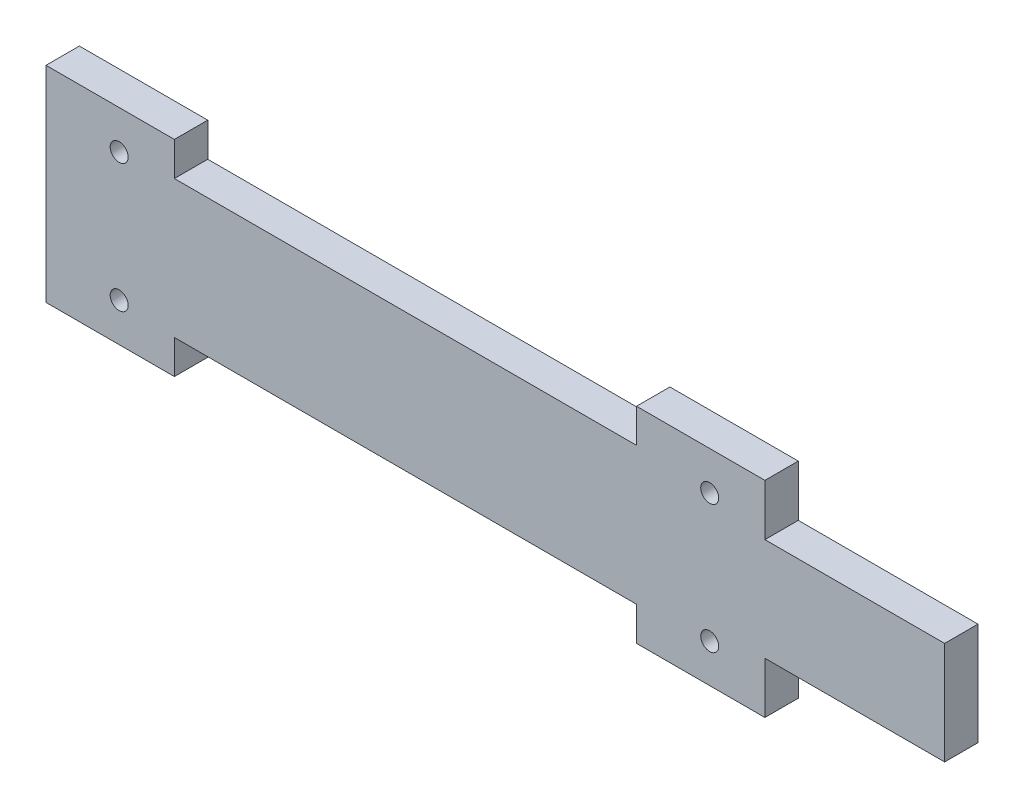
ISO-10303-21;
HEADER;
FILE_DESCRIPTION(('STEP AP214'),'2;1');
FILE_NAME('part.step','',(''),(''),'','','');
FILE_SCHEMA(('AUTOMOTIVE_DESIGN { 1 0 10303 214 1 1 1 1 }'));
ENDSEC;
DATA;
#1=APPLICATION_CONTEXT('core data for automotive mechanical design processes');
#2=APPLICATION_PROTOCOL_DEFINITION('international standard','automotive_design',2000,#1);
#3=PRODUCT_CONTEXT('',#1,'mechanical');
#4=PRODUCT('Part','Part','',(#3));
#5=PRODUCT_RELATED_PRODUCT_CATEGORY('part','',(#4));
#6=PRODUCT_DEFINITION_FORMATION('','',#4);
#7=PRODUCT_DEFINITION_CONTEXT('part definition',#1,'design');
#8=PRODUCT_DEFINITION('design','',#6,#7);
#9=PRODUCT_DEFINITION_SHAPE('','',#8);
#10=(LENGTH_UNIT() NAMED_UNIT(*) SI_UNIT(.MILLI.,.METRE.));
#11=(NAMED_UNIT(*) PLANE_ANGLE_UNIT() SI_UNIT($,.RADIAN.));
#12=(NAMED_UNIT(*) SI_UNIT($,.STERADIAN.) SOLID_ANGLE_UNIT());
#13=UNCERTAINTY_MEASURE_WITH_UNIT(LENGTH_MEASURE(1.E-05),#10,'distance_accuracy_value','');
#14=(GEOMETRIC_REPRESENTATION_CONTEXT(3) GLOBAL_UNCERTAINTY_ASSIGNED_CONTEXT((#13)) GLOBAL_UNIT_ASSIGNED_CONTEXT((#10,
#11,#12)) REPRESENTATION_CONTEXT('',''));
#15=CARTESIAN_POINT('',(0.,0.,0.));
#16=DIRECTION('',(0.,0.,1.));
#17=DIRECTION('',(1.,0.,0.));
#18=AXIS2_PLACEMENT_3D('',#15,#16,#17);
#19=CARTESIAN_POINT('',(0.,0.,13.));
#20=DIRECTION('',(0.,0.,-1.));
#21=DIRECTION('',(-1.,0.,0.));
#22=AXIS2_PLACEMENT_3D('',#19,#20,#21);
#23=PLANE('',#22);
#24=DIRECTION('',(-1.,0.,0.));
#25=VECTOR('',#24,1.);
#26=CARTESIAN_POINT('',(-103.143983002157,40.,13.));
#27=LINE('',#26,#25);
#28=CARTESIAN_POINT('',(-53.1439830021565,40.,13.));
#29=VERTEX_POINT('',#28);
#30=CARTESIAN_POINT('',(-103.143983002157,40.,13.));
#31=VERTEX_POINT('',#30);
#32=EDGE_CURVE('E209',#29,#31,#27,.T.);
#33=ORIENTED_EDGE('',*,*,#32,.T.);
#34=DIRECTION('',(0.,-1.,0.));
#35=VECTOR('',#34,1.);
#36=CARTESIAN_POINT('',(-103.143983002157,-40.,13.));
#37=LINE('',#36,#35);
#38=CARTESIAN_POINT('',(-103.143983002157,-40.,13.));
#39=VERTEX_POINT('',#38);
#40=EDGE_CURVE('E117',#31,#39,#37,.T.);
#41=ORIENTED_EDGE('',*,*,#40,.T.);
#42=DIRECTION('',(1.,0.,0.));
#43=VECTOR('',#42,1.);
#44=CARTESIAN_POINT('',(-103.143983002157,-40.,13.));
#45=LINE('',#44,#43);
#46=CARTESIAN_POINT('',(-53.1439830021565,-40.,13.));
#47=VERTEX_POINT('',#46);
#48=EDGE_CURVE('E248',#39,#47,#45,.T.);
#49=ORIENTED_EDGE('',*,*,#48,.T.);
#50=DIRECTION('',(0.,1.,0.));
#51=VECTOR('',#50,1.);
#52=CARTESIAN_POINT('',(-53.1439830021565,-40.,13.));
#53=LINE('',#52,#51);
#54=CARTESIAN_POINT('',(-53.1439830021565,-26.8041237113402,13.));
#55=VERTEX_POINT('',#54);
#56=EDGE_CURVE('E267',#47,#55,#53,.T.);
#57=ORIENTED_EDGE('',*,*,#56,.T.);
#58=DIRECTION('',(1.,0.,0.));
#59=VECTOR('',#58,1.);
#60=CARTESIAN_POINT('',(-53.1439830021565,-26.8041237113402,13.));
#61=LINE('',#60,#59);
#62=CARTESIAN_POINT('',(126.856016997843,-26.8041237113402,13.));
#63=VERTEX_POINT('',#62);
#64=EDGE_CURVE('E264',#55,#63,#61,.T.);
#65=ORIENTED_EDGE('',*,*,#64,.T.);
#66=DIRECTION('',(0.,-1.,0.));
#67=VECTOR('',#66,1.);
#68=CARTESIAN_POINT('',(126.856016997843,-26.8041237113402,13.));
#69=LINE('',#68,#67);
#70=CARTESIAN_POINT('',(126.856016997843,-40.,13.));
#71=VERTEX_POINT('',#70);
#72=EDGE_CURVE('E266',#63,#71,#69,.T.);
#73=ORIENTED_EDGE('',*,*,#72,.T.);
#74=DIRECTION('',(1.,0.,0.));
#75=VECTOR('',#74,1.);
#76=CARTESIAN_POINT('',(126.856016997843,-40.,13.));
#77=LINE('',#76,#75);
#78=CARTESIAN_POINT('',(176.856016997843,-40.,13.));
#79=VERTEX_POINT('',#78);
#80=EDGE_CURVE('E269',#71,#79,#77,.T.);
#81=ORIENTED_EDGE('',*,*,#80,.T.);
#82=DIRECTION('',(0.,1.,0.));
#83=VECTOR('',#82,1.);
#84=CARTESIAN_POINT('',(176.856016997843,-40.,13.));
#85=LINE('',#84,#83);
#86=CARTESIAN_POINT('',(176.856016997843,-20.,13.));
#87=VERTEX_POINT('',#86);
#88=EDGE_CURVE('E275',#79,#87,#85,.T.);
#89=ORIENTED_EDGE('',*,*,#88,.T.);
#90=DIRECTION('',(1.,0.,0.));
#91=VECTOR('',#90,1.);
#92=CARTESIAN_POINT('',(176.856016997843,-20.,13.));
#93=LINE('',#92,#91);
#94=CARTESIAN_POINT('',(246.856016997843,-20.,13.));
#95=VERTEX_POINT('',#94);
#96=EDGE_CURVE('E277',#87,#95,#93,.T.);
#97=ORIENTED_EDGE('',*,*,#96,.T.);
#98=DIRECTION('',(0.,1.,0.));
#99=VECTOR('',#98,1.);
#100=CARTESIAN_POINT('',(246.856016997843,20.,13.));
#101=LINE('',#100,#99);
#102=CARTESIAN_POINT('',(246.856016997843,20.,13.));
#103=VERTEX_POINT('',#102);
#104=EDGE_CURVE('E279',#95,#103,#101,.T.);
#105=ORIENTED_EDGE('',*,*,#104,.T.);
#106=DIRECTION('',(-1.,0.,0.));
#107=VECTOR('',#106,1.);
#108=CARTESIAN_POINT('',(176.856016997843,20.,13.));
#109=LINE('',#108,#107);
#110=CARTESIAN_POINT('',(176.856016997843,20.,13.));
#111=VERTEX_POINT('',#110);
#112=EDGE_CURVE('E281',#103,#111,#109,.T.);
#113=ORIENTED_EDGE('',*,*,#112,.T.);
#114=DIRECTION('',(0.,1.,0.));
#115=VECTOR('',#114,1.);
#116=CARTESIAN_POINT('',(176.856016997843,40.,13.));
#117=LINE('',#116,#115);
#118=CARTESIAN_POINT('',(176.856016997843,40.,13.));
#119=VERTEX_POINT('',#118);
#120=EDGE_CURVE('E283',#111,#119,#117,.T.);
#121=ORIENTED_EDGE('',*,*,#120,.T.);
#122=DIRECTION('',(-1.,0.,0.));
#123=VECTOR('',#122,1.);
#124=CARTESIAN_POINT('',(126.856016997843,40.,13.));
#125=LINE('',#124,#123);
#126=CARTESIAN_POINT('',(126.856016997843,40.,13.));
#127=VERTEX_POINT('',#126);
#128=EDGE_CURVE('E160',#119,#127,#125,.T.);
#129=ORIENTED_EDGE('',*,*,#128,.T.);
#130=DIRECTION('',(0.,-1.,0.));
#131=VECTOR('',#130,1.);
#132=CARTESIAN_POINT('',(126.856016997843,26.8041237113402,13.));
#133=LINE('',#132,#131);
#134=CARTESIAN_POINT('',(126.856016997843,26.8041237113402,13.));
#135=VERTEX_POINT('',#134);
#136=EDGE_CURVE('E154',#127,#135,#133,.T.);
#137=ORIENTED_EDGE('',*,*,#136,.T.);
#138=DIRECTION('',(-1.,0.,0.));
#139=VECTOR('',#138,1.);
#140=CARTESIAN_POINT('',(-53.1439830021566,26.8041237113402,13.));
#141=LINE('',#140,#139);
#142=CARTESIAN_POINT('',(-53.1439830021566,26.8041237113402,13.));
#143=VERTEX_POINT('',#142);
#144=EDGE_CURVE('E158',#135,#143,#141,.T.);
#145=ORIENTED_EDGE('',*,*,#144,.T.);
#146=DIRECTION('',(0.,1.,0.));
#147=VECTOR('',#146,1.);
#148=CARTESIAN_POINT('',(-53.1439830021565,40.,13.));
#149=LINE('',#148,#147);
#150=EDGE_CURVE('E50',#143,#29,#149,.T.);
#151=ORIENTED_EDGE('',*,*,#150,.T.);
#152=EDGE_LOOP('',(#33,#41,#49,#57,#65,#73,#81,#89,#97,#105,#113,#121,#129,#137,#145,#151));
#153=FACE_BOUND('',#152,.T.);
#154=CARTESIAN_POINT('',(-74.6439830021565,25.,13.));
#155=DIRECTION('',(0.,0.,1.));
#156=DIRECTION('',(1.,0.,0.));
#157=AXIS2_PLACEMENT_3D('',#154,#155,#156);
#158=CIRCLE('',#157,3.50000000000001);
#159=CARTESIAN_POINT('',(-78.1439830021566,25.,13.));
#160=VERTEX_POINT('',#159);
#161=EDGE_CURVE('E182',#160,#160,#158,.T.);
#162=ORIENTED_EDGE('',*,*,#161,.F.);
#163=EDGE_LOOP('',(#162));
#164=FACE_BOUND('',#163,.T.);
#165=CARTESIAN_POINT('',(155.356016997843,25.,13.));
#166=DIRECTION('',(0.,0.,1.));
#167=DIRECTION('',(1.,0.,0.));
#168=AXIS2_PLACEMENT_3D('',#165,#166,#167);
#169=CIRCLE('',#168,3.49999999999999);
#170=CARTESIAN_POINT('',(151.856016997843,25.,13.));
#171=VERTEX_POINT('',#170);
#172=EDGE_CURVE('E347',#171,#171,#169,.T.);
#173=ORIENTED_EDGE('',*,*,#172,.F.);
#174=EDGE_LOOP('',(#173));
#175=FACE_BOUND('',#174,.T.);
#176=CARTESIAN_POINT('',(155.356016997843,-25.,13.));
#177=DIRECTION('',(0.,0.,1.));
#178=DIRECTION('',(1.,0.,0.));
#179=AXIS2_PLACEMENT_3D('',#176,#177,#178);
#180=CIRCLE('',#179,3.49999999999999);
#181=CARTESIAN_POINT('',(151.856016997843,-25.,13.));
#182=VERTEX_POINT('',#181);
#183=EDGE_CURVE('E341',#182,#182,#180,.T.);
#184=ORIENTED_EDGE('',*,*,#183,.F.);
#185=EDGE_LOOP('',(#184));
#186=FACE_BOUND('',#185,.T.);
#187=CARTESIAN_POINT('',(-74.6439830021565,-25.,13.));
#188=DIRECTION('',(0.,0.,1.));
#189=DIRECTION('',(1.,0.,0.));
#190=AXIS2_PLACEMENT_3D('',#187,#188,#189);
#191=CIRCLE('',#190,3.50000000000001);
#192=CARTESIAN_POINT('',(-78.1439830021566,-25.,13.));
#193=VERTEX_POINT('',#192);
#194=EDGE_CURVE('E332',#193,#193,#191,.T.);
#195=ORIENTED_EDGE('',*,*,#194,.F.);
#196=EDGE_LOOP('',(#195));
#197=FACE_BOUND('',#196,.T.);
#198=ADVANCED_FACE('F33',(#153,#164,#175,#186,#197),#23,.F.);
#199=CARTESIAN_POINT('',(0.,0.,0.));
#200=DIRECTION('',(0.,0.,-1.));
#201=DIRECTION('',(-1.,0.,0.));
#202=AXIS2_PLACEMENT_3D('',#199,#200,#201);
#203=PLANE('',#202);
#204=CARTESIAN_POINT('',(155.356016997843,-25.,0.));
#205=DIRECTION('',(0.,0.,1.));
#206=DIRECTION('',(1.,0.,0.));
#207=AXIS2_PLACEMENT_3D('',#204,#205,#206);
#208=CIRCLE('',#207,3.49999999999999);
#209=CARTESIAN_POINT('',(151.856016997843,-25.,0.));
#210=VERTEX_POINT('',#209);
#211=EDGE_CURVE('E338',#210,#210,#208,.T.);
#212=ORIENTED_EDGE('',*,*,#211,.T.);
#213=EDGE_LOOP('',(#212));
#214=FACE_BOUND('',#213,.T.);
#215=CARTESIAN_POINT('',(-74.6439830021565,25.,0.));
#216=DIRECTION('',(0.,0.,1.));
#217=DIRECTION('',(1.,0.,0.));
#218=AXIS2_PLACEMENT_3D('',#215,#216,#217);
#219=CIRCLE('',#218,3.50000000000001);
#220=CARTESIAN_POINT('',(-78.1439830021566,25.,0.));
#221=VERTEX_POINT('',#220);
#222=EDGE_CURVE('E350',#221,#221,#219,.T.);
#223=ORIENTED_EDGE('',*,*,#222,.T.);
#224=EDGE_LOOP('',(#223));
#225=FACE_BOUND('',#224,.T.);
#226=DIRECTION('',(-1.,0.,0.));
#227=VECTOR('',#226,1.);
#228=CARTESIAN_POINT('',(-103.143983002157,40.,0.));
#229=LINE('',#228,#227);
#230=CARTESIAN_POINT('',(-53.1439830021565,40.,0.));
#231=VERTEX_POINT('',#230);
#232=CARTESIAN_POINT('',(-103.143983002157,40.,0.));
#233=VERTEX_POINT('',#232);
#234=EDGE_CURVE('E178',#231,#233,#229,.T.);
#235=ORIENTED_EDGE('',*,*,#234,.F.);
#236=DIRECTION('',(0.,1.,0.));
#237=VECTOR('',#236,1.);
#238=CARTESIAN_POINT('',(-53.1439830021565,40.,0.));
#239=LINE('',#238,#237);
#240=CARTESIAN_POINT('',(-53.1439830021566,26.8041237113402,0.));
#241=VERTEX_POINT('',#240);
#242=EDGE_CURVE('E109',#241,#231,#239,.T.);
#243=ORIENTED_EDGE('',*,*,#242,.F.);
#244=DIRECTION('',(-1.,0.,0.));
#245=VECTOR('',#244,1.);
#246=CARTESIAN_POINT('',(-53.1439830021566,26.8041237113402,0.));
#247=LINE('',#246,#245);
#248=CARTESIAN_POINT('',(126.856016997843,26.8041237113402,0.));
#249=VERTEX_POINT('',#248);
#250=EDGE_CURVE('E103',#249,#241,#247,.T.);
#251=ORIENTED_EDGE('',*,*,#250,.F.);
#252=DIRECTION('',(0.,-1.,0.));
#253=VECTOR('',#252,1.);
#254=CARTESIAN_POINT('',(126.856016997843,26.8041237113402,0.));
#255=LINE('',#254,#253);
#256=CARTESIAN_POINT('',(126.856016997843,40.,0.));
#257=VERTEX_POINT('',#256);
#258=EDGE_CURVE('E168',#257,#249,#255,.T.);
#259=ORIENTED_EDGE('',*,*,#258,.F.);
#260=DIRECTION('',(-1.,0.,0.));
#261=VECTOR('',#260,1.);
#262=CARTESIAN_POINT('',(126.856016997843,40.,0.));
#263=LINE('',#262,#261);
#264=CARTESIAN_POINT('',(176.856016997843,40.,0.));
#265=VERTEX_POINT('',#264);
#266=EDGE_CURVE('E204',#265,#257,#263,.T.);
#267=ORIENTED_EDGE('',*,*,#266,.F.);
#268=DIRECTION('',(0.,1.,0.));
#269=VECTOR('',#268,1.);
#270=CARTESIAN_POINT('',(176.856016997843,40.,0.));
#271=LINE('',#270,#269);
#272=CARTESIAN_POINT('',(176.856016997843,20.,0.));
#273=VERTEX_POINT('',#272);
#274=EDGE_CURVE('E202',#273,#265,#271,.T.);
#275=ORIENTED_EDGE('',*,*,#274,.F.);
#276=DIRECTION('',(-1.,0.,0.));
#277=VECTOR('',#276,1.);
#278=CARTESIAN_POINT('',(176.856016997843,20.,0.));
#279=LINE('',#278,#277);
#280=CARTESIAN_POINT('',(246.856016997843,20.,0.));
#281=VERTEX_POINT('',#280);
#282=EDGE_CURVE('E200',#281,#273,#279,.T.);
#283=ORIENTED_EDGE('',*,*,#282,.F.);
#284=DIRECTION('',(0.,1.,0.));
#285=VECTOR('',#284,1.);
#286=CARTESIAN_POINT('',(246.856016997843,20.,0.));
#287=LINE('',#286,#285);
#288=CARTESIAN_POINT('',(246.856016997843,-20.,0.));
#289=VERTEX_POINT('',#288);
#290=EDGE_CURVE('E198',#289,#281,#287,.T.);
#291=ORIENTED_EDGE('',*,*,#290,.F.);
#292=DIRECTION('',(1.,0.,0.));
#293=VECTOR('',#292,1.);
#294=CARTESIAN_POINT('',(176.856016997843,-20.,0.));
#295=LINE('',#294,#293);
#296=CARTESIAN_POINT('',(176.856016997843,-20.,0.));
#297=VERTEX_POINT('',#296);
#298=EDGE_CURVE('E196',#297,#289,#295,.T.);
#299=ORIENTED_EDGE('',*,*,#298,.F.);
#300=DIRECTION('',(0.,1.,0.));
#301=VECTOR('',#300,1.);
#302=CARTESIAN_POINT('',(176.856016997843,-40.,0.));
#303=LINE('',#302,#301);
#304=CARTESIAN_POINT('',(176.856016997843,-40.,0.));
#305=VERTEX_POINT('',#304);
#306=EDGE_CURVE('E194',#305,#297,#303,.T.);
#307=ORIENTED_EDGE('',*,*,#306,.F.);
#308=DIRECTION('',(1.,0.,0.));
#309=VECTOR('',#308,1.);
#310=CARTESIAN_POINT('',(126.856016997843,-40.,0.));
#311=LINE('',#310,#309);
#312=CARTESIAN_POINT('',(126.856016997843,-40.,0.));
#313=VERTEX_POINT('',#312);
#314=EDGE_CURVE('E192',#313,#305,#311,.T.);
#315=ORIENTED_EDGE('',*,*,#314,.F.);
#316=DIRECTION('',(0.,-1.,0.));
#317=VECTOR('',#316,1.);
#318=CARTESIAN_POINT('',(126.856016997843,-26.8041237113402,0.));
#319=LINE('',#318,#317);
#320=CARTESIAN_POINT('',(126.856016997843,-26.8041237113402,0.));
#321=VERTEX_POINT('',#320);
#322=EDGE_CURVE('E190',#321,#313,#319,.T.);
#323=ORIENTED_EDGE('',*,*,#322,.F.);
#324=DIRECTION('',(1.,0.,0.));
#325=VECTOR('',#324,1.);
#326=CARTESIAN_POINT('',(-53.1439830021565,-26.8041237113402,0.));
#327=LINE('',#326,#325);
#328=CARTESIAN_POINT('',(-53.1439830021565,-26.8041237113402,0.));
#329=VERTEX_POINT('',#328);
#330=EDGE_CURVE('E188',#329,#321,#327,.T.);
#331=ORIENTED_EDGE('',*,*,#330,.F.);
#332=DIRECTION('',(0.,1.,0.));
#333=VECTOR('',#332,1.);
#334=CARTESIAN_POINT('',(-53.1439830021565,-40.,0.));
#335=LINE('',#334,#333);
#336=CARTESIAN_POINT('',(-53.1439830021565,-40.,0.));
#337=VERTEX_POINT('',#336);
#338=EDGE_CURVE('E186',#337,#329,#335,.T.);
#339=ORIENTED_EDGE('',*,*,#338,.F.);
#340=DIRECTION('',(1.,0.,0.));
#341=VECTOR('',#340,1.);
#342=CARTESIAN_POINT('',(-103.143983002157,-40.,0.));
#343=LINE('',#342,#341);
#344=CARTESIAN_POINT('',(-103.143983002157,-40.,0.));
#345=VERTEX_POINT('',#344);
#346=EDGE_CURVE('E184',#345,#337,#343,.T.);
#347=ORIENTED_EDGE('',*,*,#346,.F.);
#348=DIRECTION('',(0.,-1.,0.));
#349=VECTOR('',#348,1.);
#350=CARTESIAN_POINT('',(-103.143983002157,-40.,0.));
#351=LINE('',#350,#349);
#352=EDGE_CURVE('E181',#233,#345,#351,.T.);
#353=ORIENTED_EDGE('',*,*,#352,.F.);
#354=EDGE_LOOP('',(#235,#243,#251,#259,#267,#275,#283,#291,#299,#307,#315,#323,#331,#339,#347,#353));
#355=FACE_BOUND('',#354,.T.);
#356=CARTESIAN_POINT('',(155.356016997843,25.,0.));
#357=DIRECTION('',(0.,0.,1.));
#358=DIRECTION('',(1.,0.,0.));
#359=AXIS2_PLACEMENT_3D('',#356,#357,#358);
#360=CIRCLE('',#359,3.49999999999999);
#361=CARTESIAN_POINT('',(151.856016997843,25.,0.));
#362=VERTEX_POINT('',#361);
#363=EDGE_CURVE('E344',#362,#362,#360,.T.);
#364=ORIENTED_EDGE('',*,*,#363,.T.);
#365=EDGE_LOOP('',(#364));
#366=FACE_BOUND('',#365,.T.);
#367=CARTESIAN_POINT('',(-74.6439830021565,-25.,0.));
#368=DIRECTION('',(0.,0.,1.));
#369=DIRECTION('',(1.,0.,0.));
#370=AXIS2_PLACEMENT_3D('',#367,#368,#369);
#371=CIRCLE('',#370,3.50000000000001);
#372=CARTESIAN_POINT('',(-78.1439830021566,-25.,0.));
#373=VERTEX_POINT('',#372);
#374=EDGE_CURVE('E335',#373,#373,#371,.T.);
#375=ORIENTED_EDGE('',*,*,#374,.T.);
#376=EDGE_LOOP('',(#375));
#377=FACE_BOUND('',#376,.T.);
#378=ADVANCED_FACE('F252',(#214,#225,#355,#366,#377),#203,.T.);
#379=CARTESIAN_POINT('',(-103.143983002157,40.,13.));
#380=DIRECTION('',(0.,-1.,0.));
#381=DIRECTION('',(0.,0.,-1.));
#382=AXIS2_PLACEMENT_3D('',#379,#380,#381);
#383=PLANE('',#382);
#384=ORIENTED_EDGE('',*,*,#234,.T.);
#385=DIRECTION('',(0.,0.,-1.));
#386=VECTOR('',#385,1.);
#387=CARTESIAN_POINT('',(-103.143983002157,40.,13.));
#388=LINE('',#387,#386);
#389=EDGE_CURVE('E11',#31,#233,#388,.T.);
#390=ORIENTED_EDGE('',*,*,#389,.F.);
#391=ORIENTED_EDGE('',*,*,#32,.F.);
#392=DIRECTION('',(0.,0.,-1.));
#393=VECTOR('',#392,1.);
#394=CARTESIAN_POINT('',(-53.1439830021565,40.,13.));
#395=LINE('',#394,#393);
#396=EDGE_CURVE('E174',#29,#231,#395,.T.);
#397=ORIENTED_EDGE('',*,*,#396,.T.);
#398=EDGE_LOOP('',(#384,#390,#391,#397));
#399=FACE_BOUND('',#398,.T.);
#400=ADVANCED_FACE('F35',(#399),#383,.F.);
#401=CARTESIAN_POINT('',(-103.143983002157,-40.,13.));
#402=DIRECTION('',(1.,0.,0.));
#403=DIRECTION('',(0.,0.,-1.));
#404=AXIS2_PLACEMENT_3D('',#401,#402,#403);
#405=PLANE('',#404);
#406=ORIENTED_EDGE('',*,*,#352,.T.);
#407=DIRECTION('',(0.,0.,-1.));
#408=VECTOR('',#407,1.);
#409=CARTESIAN_POINT('',(-103.143983002157,-40.,13.));
#410=LINE('',#409,#408);
#411=EDGE_CURVE('E42',#39,#345,#410,.T.);
#412=ORIENTED_EDGE('',*,*,#411,.F.);
#413=ORIENTED_EDGE('',*,*,#40,.F.);
#414=ORIENTED_EDGE('',*,*,#389,.T.);
#415=EDGE_LOOP('',(#406,#412,#413,#414));
#416=FACE_BOUND('',#415,.T.);
#417=ADVANCED_FACE('F502',(#416),#405,.F.);
#418=CARTESIAN_POINT('',(-103.143983002157,-40.,13.));
#419=DIRECTION('',(0.,1.,0.));
#420=DIRECTION('',(0.,0.,1.));
#421=AXIS2_PLACEMENT_3D('',#418,#419,#420);
#422=PLANE('',#421);
#423=ORIENTED_EDGE('',*,*,#346,.T.);
#424=DIRECTION('',(0.,0.,-1.));
#425=VECTOR('',#424,1.);
#426=CARTESIAN_POINT('',(-53.1439830021565,-40.,13.));
#427=LINE('',#426,#425);
#428=EDGE_CURVE('E240',#47,#337,#427,.T.);
#429=ORIENTED_EDGE('',*,*,#428,.F.);
#430=ORIENTED_EDGE('',*,*,#48,.F.);
#431=ORIENTED_EDGE('',*,*,#411,.T.);
#432=EDGE_LOOP('',(#423,#429,#430,#431));
#433=FACE_BOUND('',#432,.T.);
#434=ADVANCED_FACE('F246',(#433),#422,.F.);
#435=CARTESIAN_POINT('',(-53.1439830021565,-40.,13.));
#436=DIRECTION('',(-1.,0.,0.));
#437=DIRECTION('',(0.,0.,1.));
#438=AXIS2_PLACEMENT_3D('',#435,#436,#437);
#439=PLANE('',#438);
#440=ORIENTED_EDGE('',*,*,#338,.T.);
#441=DIRECTION('',(0.,0.,-1.));
#442=VECTOR('',#441,1.);
#443=CARTESIAN_POINT('',(-53.1439830021565,-26.8041237113402,13.));
#444=LINE('',#443,#442);
#445=EDGE_CURVE('E237',#55,#329,#444,.T.);
#446=ORIENTED_EDGE('',*,*,#445,.F.);
#447=ORIENTED_EDGE('',*,*,#56,.F.);
#448=ORIENTED_EDGE('',*,*,#428,.T.);
#449=EDGE_LOOP('',(#440,#446,#447,#448));
#450=FACE_BOUND('',#449,.T.);
#451=ADVANCED_FACE('F258',(#450),#439,.F.);
#452=CARTESIAN_POINT('',(-53.1439830021565,-26.8041237113402,13.));
#453=DIRECTION('',(0.,1.,0.));
#454=DIRECTION('',(0.,0.,1.));
#455=AXIS2_PLACEMENT_3D('',#452,#453,#454);
#456=PLANE('',#455);
#457=ORIENTED_EDGE('',*,*,#330,.T.);
#458=DIRECTION('',(0.,0.,-1.));
#459=VECTOR('',#458,1.);
#460=CARTESIAN_POINT('',(126.856016997843,-26.8041237113402,13.));
#461=LINE('',#460,#459);
#462=EDGE_CURVE('E234',#63,#321,#461,.T.);
#463=ORIENTED_EDGE('',*,*,#462,.F.);
#464=ORIENTED_EDGE('',*,*,#64,.F.);
#465=ORIENTED_EDGE('',*,*,#445,.T.);
#466=EDGE_LOOP('',(#457,#463,#464,#465));
#467=FACE_BOUND('',#466,.T.);
#468=ADVANCED_FACE('F262',(#467),#456,.F.);
#469=CARTESIAN_POINT('',(126.856016997843,-26.8041237113402,13.));
#470=DIRECTION('',(1.,0.,0.));
#471=DIRECTION('',(0.,0.,-1.));
#472=AXIS2_PLACEMENT_3D('',#469,#470,#471);
#473=PLANE('',#472);
#474=ORIENTED_EDGE('',*,*,#322,.T.);
#475=DIRECTION('',(0.,0.,-1.));
#476=VECTOR('',#475,1.);
#477=CARTESIAN_POINT('',(126.856016997843,-40.,13.));
#478=LINE('',#477,#476);
#479=EDGE_CURVE('E231',#71,#313,#478,.T.);
#480=ORIENTED_EDGE('',*,*,#479,.F.);
#481=ORIENTED_EDGE('',*,*,#72,.F.);
#482=ORIENTED_EDGE('',*,*,#462,.T.);
#483=EDGE_LOOP('',(#474,#480,#481,#482));
#484=FACE_BOUND('',#483,.T.);
#485=ADVANCED_FACE('F467',(#484),#473,.F.);
#486=CARTESIAN_POINT('',(126.856016997843,-40.,13.));
#487=DIRECTION('',(0.,1.,0.));
#488=DIRECTION('',(0.,0.,1.));
#489=AXIS2_PLACEMENT_3D('',#486,#487,#488);
#490=PLANE('',#489);
#491=ORIENTED_EDGE('',*,*,#314,.T.);
#492=DIRECTION('',(0.,0.,-1.));
#493=VECTOR('',#492,1.);
#494=CARTESIAN_POINT('',(176.856016997843,-40.,13.));
#495=LINE('',#494,#493);
#496=EDGE_CURVE('E228',#79,#305,#495,.T.);
#497=ORIENTED_EDGE('',*,*,#496,.F.);
#498=ORIENTED_EDGE('',*,*,#80,.F.);
#499=ORIENTED_EDGE('',*,*,#479,.T.);
#500=EDGE_LOOP('',(#491,#497,#498,#499));
#501=FACE_BOUND('',#500,.T.);
#502=ADVANCED_FACE('F457',(#501),#490,.F.);
#503=CARTESIAN_POINT('',(176.856016997843,-40.,13.));
#504=DIRECTION('',(-1.,0.,0.));
#505=DIRECTION('',(0.,0.,1.));
#506=AXIS2_PLACEMENT_3D('',#503,#504,#505);
#507=PLANE('',#506);
#508=ORIENTED_EDGE('',*,*,#306,.T.);
#509=DIRECTION('',(0.,0.,-1.));
#510=VECTOR('',#509,1.);
#511=CARTESIAN_POINT('',(176.856016997843,-20.,13.));
#512=LINE('',#511,#510);
#513=EDGE_CURVE('E225',#87,#297,#512,.T.);
#514=ORIENTED_EDGE('',*,*,#513,.F.);
#515=ORIENTED_EDGE('',*,*,#88,.F.);
#516=ORIENTED_EDGE('',*,*,#496,.T.);
#517=EDGE_LOOP('',(#508,#514,#515,#516));
#518=FACE_BOUND('',#517,.T.);
#519=ADVANCED_FACE('F447',(#518),#507,.F.);
#520=CARTESIAN_POINT('',(176.856016997843,-20.,13.));
#521=DIRECTION('',(0.,1.,0.));
#522=DIRECTION('',(0.,0.,1.));
#523=AXIS2_PLACEMENT_3D('',#520,#521,#522);
#524=PLANE('',#523);
#525=ORIENTED_EDGE('',*,*,#298,.T.);
#526=DIRECTION('',(0.,0.,-1.));
#527=VECTOR('',#526,1.);
#528=CARTESIAN_POINT('',(246.856016997843,-20.,13.));
#529=LINE('',#528,#527);
#530=EDGE_CURVE('E222',#95,#289,#529,.T.);
#531=ORIENTED_EDGE('',*,*,#530,.F.);
#532=ORIENTED_EDGE('',*,*,#96,.F.);
#533=ORIENTED_EDGE('',*,*,#513,.T.);
#534=EDGE_LOOP('',(#525,#531,#532,#533));
#535=FACE_BOUND('',#534,.T.);
#536=ADVANCED_FACE('F437',(#535),#524,.F.);
#537=CARTESIAN_POINT('',(246.856016997843,20.,13.));
#538=DIRECTION('',(-1.,0.,0.));
#539=DIRECTION('',(0.,0.,1.));
#540=AXIS2_PLACEMENT_3D('',#537,#538,#539);
#541=PLANE('',#540);
#542=ORIENTED_EDGE('',*,*,#290,.T.);
#543=DIRECTION('',(0.,0.,-1.));
#544=VECTOR('',#543,1.);
#545=CARTESIAN_POINT('',(246.856016997843,20.,13.));
#546=LINE('',#545,#544);
#547=EDGE_CURVE('E219',#103,#281,#546,.T.);
#548=ORIENTED_EDGE('',*,*,#547,.F.);
#549=ORIENTED_EDGE('',*,*,#104,.F.);
#550=ORIENTED_EDGE('',*,*,#530,.T.);
#551=EDGE_LOOP('',(#542,#548,#549,#550));
#552=FACE_BOUND('',#551,.T.);
#553=ADVANCED_FACE('F427',(#552),#541,.F.);
#554=CARTESIAN_POINT('',(176.856016997843,20.,13.));
#555=DIRECTION('',(0.,-1.,0.));
#556=DIRECTION('',(0.,0.,-1.));
#557=AXIS2_PLACEMENT_3D('',#554,#555,#556);
#558=PLANE('',#557);
#559=ORIENTED_EDGE('',*,*,#282,.T.);
#560=DIRECTION('',(0.,0.,-1.));
#561=VECTOR('',#560,1.);
#562=CARTESIAN_POINT('',(176.856016997843,20.,13.));
#563=LINE('',#562,#561);
#564=EDGE_CURVE('E216',#111,#273,#563,.T.);
#565=ORIENTED_EDGE('',*,*,#564,.F.);
#566=ORIENTED_EDGE('',*,*,#112,.F.);
#567=ORIENTED_EDGE('',*,*,#547,.T.);
#568=EDGE_LOOP('',(#559,#565,#566,#567));
#569=FACE_BOUND('',#568,.T.);
#570=ADVANCED_FACE('F418',(#569),#558,.F.);
#571=CARTESIAN_POINT('',(176.856016997843,40.,13.));
#572=DIRECTION('',(-1.,0.,0.));
#573=DIRECTION('',(0.,0.,1.));
#574=AXIS2_PLACEMENT_3D('',#571,#572,#573);
#575=PLANE('',#574);
#576=ORIENTED_EDGE('',*,*,#274,.T.);
#577=DIRECTION('',(0.,0.,-1.));
#578=VECTOR('',#577,1.);
#579=CARTESIAN_POINT('',(176.856016997843,40.,13.));
#580=LINE('',#579,#578);
#581=EDGE_CURVE('E213',#119,#265,#580,.T.);
#582=ORIENTED_EDGE('',*,*,#581,.F.);
#583=ORIENTED_EDGE('',*,*,#120,.F.);
#584=ORIENTED_EDGE('',*,*,#564,.T.);
#585=EDGE_LOOP('',(#576,#582,#583,#584));
#586=FACE_BOUND('',#585,.T.);
#587=ADVANCED_FACE('F289',(#586),#575,.F.);
#588=CARTESIAN_POINT('',(126.856016997843,40.,13.));
#589=DIRECTION('',(0.,-1.,0.));
#590=DIRECTION('',(0.,0.,-1.));
#591=AXIS2_PLACEMENT_3D('',#588,#589,#590);
#592=PLANE('',#591);
#593=ORIENTED_EDGE('',*,*,#266,.T.);
#594=DIRECTION('',(0.,0.,-1.));
#595=VECTOR('',#594,1.);
#596=CARTESIAN_POINT('',(126.856016997843,40.,13.));
#597=LINE('',#596,#595);
#598=EDGE_CURVE('E169',#127,#257,#597,.T.);
#599=ORIENTED_EDGE('',*,*,#598,.F.);
#600=ORIENTED_EDGE('',*,*,#128,.F.);
#601=ORIENTED_EDGE('',*,*,#581,.T.);
#602=EDGE_LOOP('',(#593,#599,#600,#601));
#603=FACE_BOUND('',#602,.T.);
#604=ADVANCED_FACE('F293',(#603),#592,.F.);
#605=CARTESIAN_POINT('',(126.856016997843,26.8041237113402,13.));
#606=DIRECTION('',(1.,0.,0.));
#607=DIRECTION('',(0.,0.,-1.));
#608=AXIS2_PLACEMENT_3D('',#605,#606,#607);
#609=PLANE('',#608);
#610=ORIENTED_EDGE('',*,*,#258,.T.);
#611=DIRECTION('',(0.,0.,-1.));
#612=VECTOR('',#611,1.);
#613=CARTESIAN_POINT('',(126.856016997843,26.8041237113402,13.));
#614=LINE('',#613,#612);
#615=EDGE_CURVE('E165',#135,#249,#614,.T.);
#616=ORIENTED_EDGE('',*,*,#615,.F.);
#617=ORIENTED_EDGE('',*,*,#136,.F.);
#618=ORIENTED_EDGE('',*,*,#598,.T.);
#619=EDGE_LOOP('',(#610,#616,#617,#618));
#620=FACE_BOUND('',#619,.T.);
#621=ADVANCED_FACE('F166',(#620),#609,.F.);
#622=CARTESIAN_POINT('',(-53.1439830021566,26.8041237113402,13.));
#623=DIRECTION('',(0.,-1.,0.));
#624=DIRECTION('',(1.,0.,0.));
#625=AXIS2_PLACEMENT_3D('',#622,#623,#624);
#626=PLANE('',#625);
#627=ORIENTED_EDGE('',*,*,#250,.T.);
#628=DIRECTION('',(0.,0.,-1.));
#629=VECTOR('',#628,1.);
#630=CARTESIAN_POINT('',(-53.1439830021566,26.8041237113402,13.));
#631=LINE('',#630,#629);
#632=EDGE_CURVE('E170',#143,#241,#631,.T.);
#633=ORIENTED_EDGE('',*,*,#632,.F.);
#634=ORIENTED_EDGE('',*,*,#144,.F.);
#635=ORIENTED_EDGE('',*,*,#615,.T.);
#636=EDGE_LOOP('',(#627,#633,#634,#635));
#637=FACE_BOUND('',#636,.T.);
#638=ADVANCED_FACE('F172',(#637),#626,.F.);
#639=CARTESIAN_POINT('',(-53.1439830021565,40.,13.));
#640=DIRECTION('',(-1.,0.,0.));
#641=DIRECTION('',(0.,-1.,0.));
#642=AXIS2_PLACEMENT_3D('',#639,#640,#641);
#643=PLANE('',#642);
#644=ORIENTED_EDGE('',*,*,#242,.T.);
#645=ORIENTED_EDGE('',*,*,#396,.F.);
#646=ORIENTED_EDGE('',*,*,#150,.F.);
#647=ORIENTED_EDGE('',*,*,#632,.T.);
#648=EDGE_LOOP('',(#644,#645,#646,#647));
#649=FACE_BOUND('',#648,.T.);
#650=ADVANCED_FACE('F297',(#649),#643,.F.);
#651=CARTESIAN_POINT('',(-74.6439830021565,25.,13.));
#652=DIRECTION('',(0.,0.,-1.));
#653=DIRECTION('',(-1.,0.,0.));
#654=AXIS2_PLACEMENT_3D('',#651,#652,#653);
#655=CYLINDRICAL_SURFACE('',#654,3.50000000000001);
#656=CARTESIAN_POINT('',(-78.1439830021566,25.,13.));
#657=CARTESIAN_POINT('',(-78.1439830021566,25.,12.8645833333333));
#658=CARTESIAN_POINT('',(-78.1439830021566,25.,12.7291666666667));
#659=CARTESIAN_POINT('',(-78.1439830021566,25.,12.4583333333333));
#660=CARTESIAN_POINT('',(-78.1439830021566,25.,12.3229166666667));
#661=CARTESIAN_POINT('',(-78.1439830021566,25.,12.0520833333333));
#662=CARTESIAN_POINT('',(-78.1439830021566,25.,11.9166666666667));
#663=CARTESIAN_POINT('',(-78.1439830021566,25.,11.6458333333333));
#664=CARTESIAN_POINT('',(-78.1439830021566,25.,11.5104166666667));
#665=CARTESIAN_POINT('',(-78.1439830021566,25.,11.2395833333333));
#666=CARTESIAN_POINT('',(-78.1439830021566,25.,11.1041666666667));
#667=CARTESIAN_POINT('',(-78.1439830021566,25.,10.8333333333333));
#668=CARTESIAN_POINT('',(-78.1439830021566,25.,10.6979166666667));
#669=CARTESIAN_POINT('',(-78.1439830021566,25.,10.4270833333333));
#670=CARTESIAN_POINT('',(-78.1439830021566,25.,10.2916666666667));
#671=CARTESIAN_POINT('',(-78.1439830021566,25.,10.0208333333333));
#672=CARTESIAN_POINT('',(-78.1439830021566,25.,9.88541666666667));
#673=CARTESIAN_POINT('',(-78.1439830021566,25.,9.61458333333333));
#674=CARTESIAN_POINT('',(-78.1439830021566,25.,9.47916666666667));
#675=CARTESIAN_POINT('',(-78.1439830021566,25.,9.20833333333333));
#676=CARTESIAN_POINT('',(-78.1439830021566,25.,9.07291666666667));
#677=CARTESIAN_POINT('',(-78.1439830021566,25.,8.80208333333333));
#678=CARTESIAN_POINT('',(-78.1439830021566,25.,8.66666666666667));
#679=CARTESIAN_POINT('',(-78.1439830021566,25.,8.39583333333333));
#680=CARTESIAN_POINT('',(-78.1439830021566,25.,8.26041666666667));
#681=CARTESIAN_POINT('',(-78.1439830021566,25.,7.98958333333333));
#682=CARTESIAN_POINT('',(-78.1439830021566,25.,7.85416666666667));
#683=CARTESIAN_POINT('',(-78.1439830021566,25.,7.58333333333333));
#684=CARTESIAN_POINT('',(-78.1439830021566,25.,7.44791666666667));
#685=CARTESIAN_POINT('',(-78.1439830021566,25.,7.17708333333333));
#686=CARTESIAN_POINT('',(-78.1439830021566,25.,7.04166666666667));
#687=CARTESIAN_POINT('',(-78.1439830021566,25.,6.77083333333333));
#688=CARTESIAN_POINT('',(-78.1439830021566,25.,6.63541666666667));
#689=CARTESIAN_POINT('',(-78.1439830021566,25.,6.36458333333333));
#690=CARTESIAN_POINT('',(-78.1439830021566,25.,6.22916666666667));
#691=CARTESIAN_POINT('',(-78.1439830021566,25.,5.95833333333333));
#692=CARTESIAN_POINT('',(-78.1439830021566,25.,5.82291666666667));
#693=CARTESIAN_POINT('',(-78.1439830021566,25.,5.55208333333333));
#694=CARTESIAN_POINT('',(-78.1439830021566,25.,5.41666666666667));
#695=CARTESIAN_POINT('',(-78.1439830021566,25.,5.14583333333333));
#696=CARTESIAN_POINT('',(-78.1439830021566,25.,5.01041666666667));
#697=CARTESIAN_POINT('',(-78.1439830021566,25.,4.73958333333333));
#698=CARTESIAN_POINT('',(-78.1439830021566,25.,4.60416666666667));
#699=CARTESIAN_POINT('',(-78.1439830021566,25.,4.33333333333333));
#700=CARTESIAN_POINT('',(-78.1439830021566,25.,4.19791666666667));
#701=CARTESIAN_POINT('',(-78.1439830021566,25.,3.92708333333333));
#702=CARTESIAN_POINT('',(-78.1439830021566,25.,3.79166666666667));
#703=CARTESIAN_POINT('',(-78.1439830021566,25.,3.52083333333333));
#704=CARTESIAN_POINT('',(-78.1439830021566,25.,3.38541666666667));
#705=CARTESIAN_POINT('',(-78.1439830021566,25.,3.11458333333333));
#706=CARTESIAN_POINT('',(-78.1439830021566,25.,2.97916666666667));
#707=CARTESIAN_POINT('',(-78.1439830021566,25.,2.70833333333333));
#708=CARTESIAN_POINT('',(-78.1439830021566,25.,2.57291666666667));
#709=CARTESIAN_POINT('',(-78.1439830021566,25.,2.30208333333333));
#710=CARTESIAN_POINT('',(-78.1439830021566,25.,2.16666666666667));
#711=CARTESIAN_POINT('',(-78.1439830021566,25.,1.89583333333333));
#712=CARTESIAN_POINT('',(-78.1439830021566,25.,1.76041666666667));
#713=CARTESIAN_POINT('',(-78.1439830021566,25.,1.48958333333333));
#714=CARTESIAN_POINT('',(-78.1439830021566,25.,1.35416666666667));
#715=CARTESIAN_POINT('',(-78.1439830021566,25.,1.08333333333333));
#716=CARTESIAN_POINT('',(-78.1439830021566,25.,0.947916666666667));
#717=CARTESIAN_POINT('',(-78.1439830021566,25.,0.677083333333334));
#718=CARTESIAN_POINT('',(-78.1439830021566,25.,0.541666666666667));
#719=CARTESIAN_POINT('',(-78.1439830021566,25.,0.270833333333334));
#720=CARTESIAN_POINT('',(-78.1439830021566,25.,0.135416666666667));
#721=CARTESIAN_POINT('',(-78.1439830021566,25.,0.));
#722=B_SPLINE_CURVE_WITH_KNOTS('',3,(#656,#657,#658,#659,#660,#661,#662,#663,#664,#665,#666,
#667,#668,#669,#670,#671,#672,#673,#674,#675,#676,#677,#678,#679,#680,#681,#682,#683,#684,#685,
#686,#687,#688,#689,#690,#691,#692,#693,#694,#695,#696,#697,#698,#699,#700,#701,#702,#703,#704,
#705,#706,#707,#708,#709,#710,#711,#712,#713,#714,#715,#716,#717,#718,#719,#720,#721),
.UNSPECIFIED.,.F.,.F.,(4,2,2,2,2,2,2,2,2,2,2,2,2,2,2,2,2,2,2,2,2,2,2,2,2,2,2,2,2,2,2,2,4),(0.,
0.406249999999999,0.812499999999999,1.21875,1.625,2.03125,2.4375,2.84375,3.25,3.65625,4.0625,
4.46875,4.875,5.28125,5.6875,6.09375,6.5,6.90625,7.3125,7.71875,8.125,8.53125,8.9375,9.34375,
9.75,10.15625,10.5625,10.96875,11.375,11.78125,12.1875,12.59375,13.),.UNSPECIFIED.);
#723=EDGE_CURVE('BSEAM299',#160,#221,#722,.T.);
#724=ORIENTED_EDGE('',*,*,#161,.T.);
#725=ORIENTED_EDGE('',*,*,#222,.F.);
#726=ORIENTED_EDGE('',*,*,#723,.T.);
#727=ORIENTED_EDGE('',*,*,#723,.F.);
#728=EDGE_LOOP('',(#724,#726,#725,#727));
#729=FACE_BOUND('',#728,.T.);
#730=ADVANCED_FACE('F299',(#729),#655,.F.);
#731=CARTESIAN_POINT('',(155.356016997843,25.,13.));
#732=DIRECTION('',(0.,0.,-1.));
#733=DIRECTION('',(-1.,0.,0.));
#734=AXIS2_PLACEMENT_3D('',#731,#732,#733);
#735=CYLINDRICAL_SURFACE('',#734,3.49999999999999);
#736=CARTESIAN_POINT('',(151.856016997843,25.,13.));
#737=CARTESIAN_POINT('',(151.856016997843,25.,12.8645833333333));
#738=CARTESIAN_POINT('',(151.856016997843,25.,12.7291666666667));
#739=CARTESIAN_POINT('',(151.856016997843,25.,12.4583333333333));
#740=CARTESIAN_POINT('',(151.856016997843,25.,12.3229166666667));
#741=CARTESIAN_POINT('',(151.856016997843,25.,12.0520833333333));
#742=CARTESIAN_POINT('',(151.856016997843,25.,11.9166666666667));
#743=CARTESIAN_POINT('',(151.856016997843,25.,11.6458333333333));
#744=CARTESIAN_POINT('',(151.856016997843,25.,11.5104166666667));
#745=CARTESIAN_POINT('',(151.856016997843,25.,11.2395833333333));
#746=CARTESIAN_POINT('',(151.856016997843,25.,11.1041666666667));
#747=CARTESIAN_POINT('',(151.856016997843,25.,10.8333333333333));
#748=CARTESIAN_POINT('',(151.856016997843,25.,10.6979166666667));
#749=CARTESIAN_POINT('',(151.856016997843,25.,10.4270833333333));
#750=CARTESIAN_POINT('',(151.856016997843,25.,10.2916666666667));
#751=CARTESIAN_POINT('',(151.856016997843,25.,10.0208333333333));
#752=CARTESIAN_POINT('',(151.856016997843,25.,9.88541666666667));
#753=CARTESIAN_POINT('',(151.856016997843,25.,9.61458333333333));
#754=CARTESIAN_POINT('',(151.856016997843,25.,9.47916666666667));
#755=CARTESIAN_POINT('',(151.856016997843,25.,9.20833333333333));
#756=CARTESIAN_POINT('',(151.856016997843,25.,9.07291666666667));
#757=CARTESIAN_POINT('',(151.856016997843,25.,8.80208333333333));
#758=CARTESIAN_POINT('',(151.856016997843,25.,8.66666666666667));
#759=CARTESIAN_POINT('',(151.856016997843,25.,8.39583333333333));
#760=CARTESIAN_POINT('',(151.856016997843,25.,8.26041666666667));
#761=CARTESIAN_POINT('',(151.856016997843,25.,7.98958333333333));
#762=CARTESIAN_POINT('',(151.856016997843,25.,7.85416666666667));
#763=CARTESIAN_POINT('',(151.856016997843,25.,7.58333333333333));
#764=CARTESIAN_POINT('',(151.856016997843,25.,7.44791666666667));
#765=CARTESIAN_POINT('',(151.856016997843,25.,7.17708333333333));
#766=CARTESIAN_POINT('',(151.856016997843,25.,7.04166666666667));
#767=CARTESIAN_POINT('',(151.856016997843,25.,6.77083333333333));
#768=CARTESIAN_POINT('',(151.856016997843,25.,6.63541666666667));
#769=CARTESIAN_POINT('',(151.856016997843,25.,6.36458333333333));
#770=CARTESIAN_POINT('',(151.856016997843,25.,6.22916666666667));
#771=CARTESIAN_POINT('',(151.856016997843,25.,5.95833333333333));
#772=CARTESIAN_POINT('',(151.856016997843,25.,5.82291666666667));
#773=CARTESIAN_POINT('',(151.856016997843,25.,5.55208333333333));
#774=CARTESIAN_POINT('',(151.856016997843,25.,5.41666666666667));
#775=CARTESIAN_POINT('',(151.856016997843,25.,5.14583333333333));
#776=CARTESIAN_POINT('',(151.856016997843,25.,5.01041666666667));
#777=CARTESIAN_POINT('',(151.856016997843,25.,4.73958333333333));
#778=CARTESIAN_POINT('',(151.856016997843,25.,4.60416666666667));
#779=CARTESIAN_POINT('',(151.856016997843,25.,4.33333333333333));
#780=CARTESIAN_POINT('',(151.856016997843,25.,4.19791666666667));
#781=CARTESIAN_POINT('',(151.856016997843,25.,3.92708333333333));
#782=CARTESIAN_POINT('',(151.856016997843,25.,3.79166666666667));
#783=CARTESIAN_POINT('',(151.856016997843,25.,3.52083333333333));
#784=CARTESIAN_POINT('',(151.856016997843,25.,3.38541666666667));
#785=CARTESIAN_POINT('',(151.856016997843,25.,3.11458333333333));
#786=CARTESIAN_POINT('',(151.856016997843,25.,2.97916666666667));
#787=CARTESIAN_POINT('',(151.856016997843,25.,2.70833333333333));
#788=CARTESIAN_POINT('',(151.856016997843,25.,2.57291666666667));
#789=CARTESIAN_POINT('',(151.856016997843,25.,2.30208333333333));
#790=CARTESIAN_POINT('',(151.856016997843,25.,2.16666666666667));
#791=CARTESIAN_POINT('',(151.856016997843,25.,1.89583333333333));
#792=CARTESIAN_POINT('',(151.856016997843,25.,1.76041666666667));
#793=CARTESIAN_POINT('',(151.856016997843,25.,1.48958333333333));
#794=CARTESIAN_POINT('',(151.856016997843,25.,1.35416666666667));
#795=CARTESIAN_POINT('',(151.856016997843,25.,1.08333333333333));
#796=CARTESIAN_POINT('',(151.856016997843,25.,0.947916666666667));
#797=CARTESIAN_POINT('',(151.856016997843,25.,0.677083333333334));
#798=CARTESIAN_POINT('',(151.856016997843,25.,0.541666666666667));
#799=CARTESIAN_POINT('',(151.856016997843,25.,0.270833333333334));
#800=CARTESIAN_POINT('',(151.856016997843,25.,0.135416666666667));
#801=CARTESIAN_POINT('',(151.856016997843,25.,0.));
#802=B_SPLINE_CURVE_WITH_KNOTS('',3,(#736,#737,#738,#739,#740,#741,#742,#743,#744,#745,#746,
#747,#748,#749,#750,#751,#752,#753,#754,#755,#756,#757,#758,#759,#760,#761,#762,#763,#764,#765,
#766,#767,#768,#769,#770,#771,#772,#773,#774,#775,#776,#777,#778,#779,#780,#781,#782,#783,#784,
#785,#786,#787,#788,#789,#790,#791,#792,#793,#794,#795,#796,#797,#798,#799,#800,#801),
.UNSPECIFIED.,.F.,.F.,(4,2,2,2,2,2,2,2,2,2,2,2,2,2,2,2,2,2,2,2,2,2,2,2,2,2,2,2,2,2,2,2,4),(0.,
0.406249999999999,0.812499999999999,1.21875,1.625,2.03125,2.4375,2.84375,3.25,3.65625,4.0625,
4.46875,4.875,5.28125,5.6875,6.09375,6.5,6.90625,7.3125,7.71875,8.125,8.53125,8.9375,9.34375,
9.75,10.15625,10.5625,10.96875,11.375,11.78125,12.1875,12.59375,13.),.UNSPECIFIED.);
#803=EDGE_CURVE('BSEAM305',#171,#362,#802,.T.);
#804=ORIENTED_EDGE('',*,*,#172,.T.);
#805=ORIENTED_EDGE('',*,*,#363,.F.);
#806=ORIENTED_EDGE('',*,*,#803,.T.);
#807=ORIENTED_EDGE('',*,*,#803,.F.);
#808=EDGE_LOOP('',(#804,#806,#805,#807));
#809=FACE_BOUND('',#808,.T.);
#810=ADVANCED_FACE('F305',(#809),#735,.F.);
#811=CARTESIAN_POINT('',(155.356016997843,-25.,13.));
#812=DIRECTION('',(0.,0.,-1.));
#813=DIRECTION('',(-1.,0.,0.));
#814=AXIS2_PLACEMENT_3D('',#811,#812,#813);
#815=CYLINDRICAL_SURFACE('',#814,3.49999999999999);
#816=CARTESIAN_POINT('',(151.856016997843,-25.,13.));
#817=CARTESIAN_POINT('',(151.856016997843,-25.,12.8645833333333));
#818=CARTESIAN_POINT('',(151.856016997843,-25.,12.7291666666667));
#819=CARTESIAN_POINT('',(151.856016997843,-25.,12.4583333333333));
#820=CARTESIAN_POINT('',(151.856016997843,-25.,12.3229166666667));
#821=CARTESIAN_POINT('',(151.856016997843,-25.,12.0520833333333));
#822=CARTESIAN_POINT('',(151.856016997843,-25.,11.9166666666667));
#823=CARTESIAN_POINT('',(151.856016997843,-25.,11.6458333333333));
#824=CARTESIAN_POINT('',(151.856016997843,-25.,11.5104166666667));
#825=CARTESIAN_POINT('',(151.856016997843,-25.,11.2395833333333));
#826=CARTESIAN_POINT('',(151.856016997843,-25.,11.1041666666667));
#827=CARTESIAN_POINT('',(151.856016997843,-25.,10.8333333333333));
#828=CARTESIAN_POINT('',(151.856016997843,-25.,10.6979166666667));
#829=CARTESIAN_POINT('',(151.856016997843,-25.,10.4270833333333));
#830=CARTESIAN_POINT('',(151.856016997843,-25.,10.2916666666667));
#831=CARTESIAN_POINT('',(151.856016997843,-25.,10.0208333333333));
#832=CARTESIAN_POINT('',(151.856016997843,-25.,9.88541666666667));
#833=CARTESIAN_POINT('',(151.856016997843,-25.,9.61458333333333));
#834=CARTESIAN_POINT('',(151.856016997843,-25.,9.47916666666667));
#835=CARTESIAN_POINT('',(151.856016997843,-25.,9.20833333333333));
#836=CARTESIAN_POINT('',(151.856016997843,-25.,9.07291666666667));
#837=CARTESIAN_POINT('',(151.856016997843,-25.,8.80208333333333));
#838=CARTESIAN_POINT('',(151.856016997843,-25.,8.66666666666667));
#839=CARTESIAN_POINT('',(151.856016997843,-25.,8.39583333333333));
#840=CARTESIAN_POINT('',(151.856016997843,-25.,8.26041666666667));
#841=CARTESIAN_POINT('',(151.856016997843,-25.,7.98958333333333));
#842=CARTESIAN_POINT('',(151.856016997843,-25.,7.85416666666667));
#843=CARTESIAN_POINT('',(151.856016997843,-25.,7.58333333333333));
#844=CARTESIAN_POINT('',(151.856016997843,-25.,7.44791666666667));
#845=CARTESIAN_POINT('',(151.856016997843,-25.,7.17708333333333));
#846=CARTESIAN_POINT('',(151.856016997843,-25.,7.04166666666667));
#847=CARTESIAN_POINT('',(151.856016997843,-25.,6.77083333333333));
#848=CARTESIAN_POINT('',(151.856016997843,-25.,6.63541666666667));
#849=CARTESIAN_POINT('',(151.856016997843,-25.,6.36458333333333));
#850=CARTESIAN_POINT('',(151.856016997843,-25.,6.22916666666667));
#851=CARTESIAN_POINT('',(151.856016997843,-25.,5.95833333333333));
#852=CARTESIAN_POINT('',(151.856016997843,-25.,5.82291666666667));
#853=CARTESIAN_POINT('',(151.856016997843,-25.,5.55208333333333));
#854=CARTESIAN_POINT('',(151.856016997843,-25.,5.41666666666667));
#855=CARTESIAN_POINT('',(151.856016997843,-25.,5.14583333333333));
#856=CARTESIAN_POINT('',(151.856016997843,-25.,5.01041666666667));
#857=CARTESIAN_POINT('',(151.856016997843,-25.,4.73958333333333));
#858=CARTESIAN_POINT('',(151.856016997843,-25.,4.60416666666667));
#859=CARTESIAN_POINT('',(151.856016997843,-25.,4.33333333333333));
#860=CARTESIAN_POINT('',(151.856016997843,-25.,4.19791666666667));
#861=CARTESIAN_POINT('',(151.856016997843,-25.,3.92708333333333));
#862=CARTESIAN_POINT('',(151.856016997843,-25.,3.79166666666667));
#863=CARTESIAN_POINT('',(151.856016997843,-25.,3.52083333333333));
#864=CARTESIAN_POINT('',(151.856016997843,-25.,3.38541666666667));
#865=CARTESIAN_POINT('',(151.856016997843,-25.,3.11458333333333));
#866=CARTESIAN_POINT('',(151.856016997843,-25.,2.97916666666667));
#867=CARTESIAN_POINT('',(151.856016997843,-25.,2.70833333333333));
#868=CARTESIAN_POINT('',(151.856016997843,-25.,2.57291666666667));
#869=CARTESIAN_POINT('',(151.856016997843,-25.,2.30208333333333));
#870=CARTESIAN_POINT('',(151.856016997843,-25.,2.16666666666667));
#871=CARTESIAN_POINT('',(151.856016997843,-25.,1.89583333333333));
#872=CARTESIAN_POINT('',(151.856016997843,-25.,1.76041666666667));
#873=CARTESIAN_POINT('',(151.856016997843,-25.,1.48958333333333));
#874=CARTESIAN_POINT('',(151.856016997843,-25.,1.35416666666667));
#875=CARTESIAN_POINT('',(151.856016997843,-25.,1.08333333333333));
#876=CARTESIAN_POINT('',(151.856016997843,-25.,0.947916666666667));
#877=CARTESIAN_POINT('',(151.856016997843,-25.,0.677083333333334));
#878=CARTESIAN_POINT('',(151.856016997843,-25.,0.541666666666667));
#879=CARTESIAN_POINT('',(151.856016997843,-25.,0.270833333333334));
#880=CARTESIAN_POINT('',(151.856016997843,-25.,0.135416666666667));
#881=CARTESIAN_POINT('',(151.856016997843,-25.,0.));
#882=B_SPLINE_CURVE_WITH_KNOTS('',3,(#816,#817,#818,#819,#820,#821,#822,#823,#824,#825,#826,
#827,#828,#829,#830,#831,#832,#833,#834,#835,#836,#837,#838,#839,#840,#841,#842,#843,#844,#845,
#846,#847,#848,#849,#850,#851,#852,#853,#854,#855,#856,#857,#858,#859,#860,#861,#862,#863,#864,
#865,#866,#867,#868,#869,#870,#871,#872,#873,#874,#875,#876,#877,#878,#879,#880,#881),
.UNSPECIFIED.,.F.,.F.,(4,2,2,2,2,2,2,2,2,2,2,2,2,2,2,2,2,2,2,2,2,2,2,2,2,2,2,2,2,2,2,2,4),(0.,
0.406249999999999,0.812499999999999,1.21875,1.625,2.03125,2.4375,2.84375,3.25,3.65625,4.0625,
4.46875,4.875,5.28125,5.6875,6.09375,6.5,6.90625,7.3125,7.71875,8.125,8.53125,8.9375,9.34375,
9.75,10.15625,10.5625,10.96875,11.375,11.78125,12.1875,12.59375,13.),.UNSPECIFIED.);
#883=EDGE_CURVE('BSEAM319',#182,#210,#882,.T.);
#884=ORIENTED_EDGE('',*,*,#183,.T.);
#885=ORIENTED_EDGE('',*,*,#211,.F.);
#886=ORIENTED_EDGE('',*,*,#883,.T.);
#887=ORIENTED_EDGE('',*,*,#883,.F.);
#888=EDGE_LOOP('',(#884,#886,#885,#887));
#889=FACE_BOUND('',#888,.T.);
#890=ADVANCED_FACE('F319',(#889),#815,.F.);
#891=CARTESIAN_POINT('',(-74.6439830021565,-25.,13.));
#892=DIRECTION('',(0.,0.,-1.));
#893=DIRECTION('',(-1.,0.,0.));
#894=AXIS2_PLACEMENT_3D('',#891,#892,#893);
#895=CYLINDRICAL_SURFACE('',#894,3.50000000000001);
#896=CARTESIAN_POINT('',(-78.1439830021566,-25.,13.));
#897=CARTESIAN_POINT('',(-78.1439830021566,-25.,12.8645833333333));
#898=CARTESIAN_POINT('',(-78.1439830021566,-25.,12.7291666666667));
#899=CARTESIAN_POINT('',(-78.1439830021566,-25.,12.4583333333333));
#900=CARTESIAN_POINT('',(-78.1439830021566,-25.,12.3229166666667));
#901=CARTESIAN_POINT('',(-78.1439830021566,-25.,12.0520833333333));
#902=CARTESIAN_POINT('',(-78.1439830021566,-25.,11.9166666666667));
#903=CARTESIAN_POINT('',(-78.1439830021566,-25.,11.6458333333333));
#904=CARTESIAN_POINT('',(-78.1439830021566,-25.,11.5104166666667));
#905=CARTESIAN_POINT('',(-78.1439830021566,-25.,11.2395833333333));
#906=CARTESIAN_POINT('',(-78.1439830021566,-25.,11.1041666666667));
#907=CARTESIAN_POINT('',(-78.1439830021566,-25.,10.8333333333333));
#908=CARTESIAN_POINT('',(-78.1439830021566,-25.,10.6979166666667));
#909=CARTESIAN_POINT('',(-78.1439830021566,-25.,10.4270833333333));
#910=CARTESIAN_POINT('',(-78.1439830021566,-25.,10.2916666666667));
#911=CARTESIAN_POINT('',(-78.1439830021566,-25.,10.0208333333333));
#912=CARTESIAN_POINT('',(-78.1439830021566,-25.,9.88541666666667));
#913=CARTESIAN_POINT('',(-78.1439830021566,-25.,9.61458333333333));
#914=CARTESIAN_POINT('',(-78.1439830021566,-25.,9.47916666666667));
#915=CARTESIAN_POINT('',(-78.1439830021566,-25.,9.20833333333333));
#916=CARTESIAN_POINT('',(-78.1439830021566,-25.,9.07291666666667));
#917=CARTESIAN_POINT('',(-78.1439830021566,-25.,8.80208333333333));
#918=CARTESIAN_POINT('',(-78.1439830021566,-25.,8.66666666666667));
#919=CARTESIAN_POINT('',(-78.1439830021566,-25.,8.39583333333333));
#920=CARTESIAN_POINT('',(-78.1439830021566,-25.,8.26041666666667));
#921=CARTESIAN_POINT('',(-78.1439830021566,-25.,7.98958333333333));
#922=CARTESIAN_POINT('',(-78.1439830021566,-25.,7.85416666666667));
#923=CARTESIAN_POINT('',(-78.1439830021566,-25.,7.58333333333333));
#924=CARTESIAN_POINT('',(-78.1439830021566,-25.,7.44791666666667));
#925=CARTESIAN_POINT('',(-78.1439830021566,-25.,7.17708333333333));
#926=CARTESIAN_POINT('',(-78.1439830021566,-25.,7.04166666666667));
#927=CARTESIAN_POINT('',(-78.1439830021566,-25.,6.77083333333333));
#928=CARTESIAN_POINT('',(-78.1439830021566,-25.,6.63541666666667));
#929=CARTESIAN_POINT('',(-78.1439830021566,-25.,6.36458333333333));
#930=CARTESIAN_POINT('',(-78.1439830021566,-25.,6.22916666666667));
#931=CARTESIAN_POINT('',(-78.1439830021566,-25.,5.95833333333333));
#932=CARTESIAN_POINT('',(-78.1439830021566,-25.,5.82291666666667));
#933=CARTESIAN_POINT('',(-78.1439830021566,-25.,5.55208333333333));
#934=CARTESIAN_POINT('',(-78.1439830021566,-25.,5.41666666666667));
#935=CARTESIAN_POINT('',(-78.1439830021566,-25.,5.14583333333333));
#936=CARTESIAN_POINT('',(-78.1439830021566,-25.,5.01041666666667));
#937=CARTESIAN_POINT('',(-78.1439830021566,-25.,4.73958333333333));
#938=CARTESIAN_POINT('',(-78.1439830021566,-25.,4.60416666666667));
#939=CARTESIAN_POINT('',(-78.1439830021566,-25.,4.33333333333333));
#940=CARTESIAN_POINT('',(-78.1439830021566,-25.,4.19791666666667));
#941=CARTESIAN_POINT('',(-78.1439830021566,-25.,3.92708333333333));
#942=CARTESIAN_POINT('',(-78.1439830021566,-25.,3.79166666666667));
#943=CARTESIAN_POINT('',(-78.1439830021566,-25.,3.52083333333333));
#944=CARTESIAN_POINT('',(-78.1439830021566,-25.,3.38541666666667));
#945=CARTESIAN_POINT('',(-78.1439830021566,-25.,3.11458333333333));
#946=CARTESIAN_POINT('',(-78.1439830021566,-25.,2.97916666666667));
#947=CARTESIAN_POINT('',(-78.1439830021566,-25.,2.70833333333333));
#948=CARTESIAN_POINT('',(-78.1439830021566,-25.,2.57291666666667));
#949=CARTESIAN_POINT('',(-78.1439830021566,-25.,2.30208333333333));
#950=CARTESIAN_POINT('',(-78.1439830021566,-25.,2.16666666666667));
#951=CARTESIAN_POINT('',(-78.1439830021566,-25.,1.89583333333333));
#952=CARTESIAN_POINT('',(-78.1439830021566,-25.,1.76041666666667));
#953=CARTESIAN_POINT('',(-78.1439830021566,-25.,1.48958333333333));
#954=CARTESIAN_POINT('',(-78.1439830021566,-25.,1.35416666666667));
#955=CARTESIAN_POINT('',(-78.1439830021566,-25.,1.08333333333333));
#956=CARTESIAN_POINT('',(-78.1439830021566,-25.,0.947916666666667));
#957=CARTESIAN_POINT('',(-78.1439830021566,-25.,0.677083333333334));
#958=CARTESIAN_POINT('',(-78.1439830021566,-25.,0.541666666666667));
#959=CARTESIAN_POINT('',(-78.1439830021566,-25.,0.270833333333334));
#960=CARTESIAN_POINT('',(-78.1439830021566,-25.,0.135416666666667));
#961=CARTESIAN_POINT('',(-78.1439830021566,-25.,0.));
#962=B_SPLINE_CURVE_WITH_KNOTS('',3,(#896,#897,#898,#899,#900,#901,#902,#903,#904,#905,#906,
#907,#908,#909,#910,#911,#912,#913,#914,#915,#916,#917,#918,#919,#920,#921,#922,#923,#924,#925,
#926,#927,#928,#929,#930,#931,#932,#933,#934,#935,#936,#937,#938,#939,#940,#941,#942,#943,#944,
#945,#946,#947,#948,#949,#950,#951,#952,#953,#954,#955,#956,#957,#958,#959,#960,#961),
.UNSPECIFIED.,.F.,.F.,(4,2,2,2,2,2,2,2,2,2,2,2,2,2,2,2,2,2,2,2,2,2,2,2,2,2,2,2,2,2,2,2,4),(0.,
0.406249999999999,0.812499999999999,1.21875,1.625,2.03125,2.4375,2.84375,3.25,3.65625,4.0625,
4.46875,4.875,5.28125,5.6875,6.09375,6.5,6.90625,7.3125,7.71875,8.125,8.53125,8.9375,9.34375,
9.75,10.15625,10.5625,10.96875,11.375,11.78125,12.1875,12.59375,13.),.UNSPECIFIED.);
#963=EDGE_CURVE('BSEAM323',#193,#373,#962,.T.);
#964=ORIENTED_EDGE('',*,*,#194,.T.);
#965=ORIENTED_EDGE('',*,*,#374,.F.);
#966=ORIENTED_EDGE('',*,*,#963,.T.);
#967=ORIENTED_EDGE('',*,*,#963,.F.);
#968=EDGE_LOOP('',(#964,#966,#965,#967));
#969=FACE_BOUND('',#968,.T.);
#970=ADVANCED_FACE('F323',(#969),#895,.F.);
#971=CLOSED_SHELL('',(#198,#378,#400,#417,#434,#451,#468,#485,#502,#519,#536,#553,#570,#587,
#604,#621,#638,#650,#730,#810,#890,#970));
#972=MANIFOLD_SOLID_BREP('B2',#971);
#973=ADVANCED_BREP_SHAPE_REPRESENTATION('',(#18,#972),#14);
#974=SHAPE_DEFINITION_REPRESENTATION(#9,#973);
ENDSEC;
END-ISO-10303-21;
